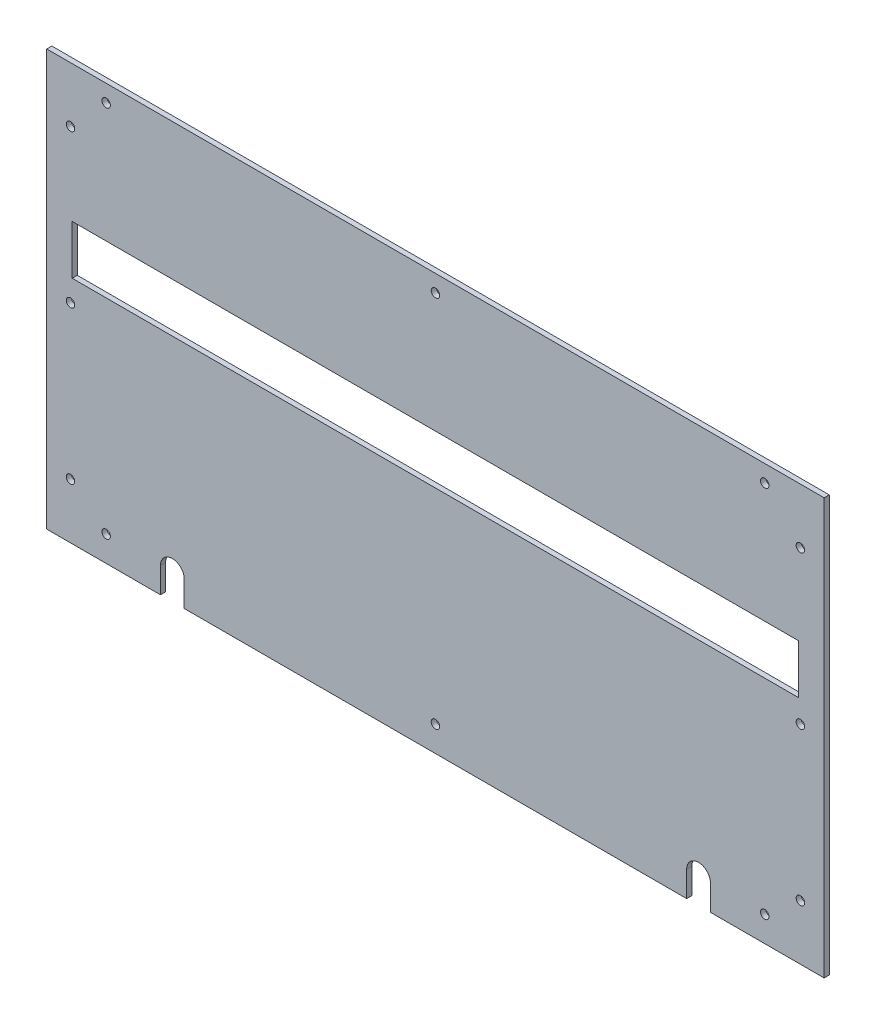
ISO-10303-21;
HEADER;
FILE_DESCRIPTION(('STEP AP214'),'2;1');
FILE_NAME('part.step','',(''),(''),'','','');
FILE_SCHEMA(('AUTOMOTIVE_DESIGN { 1 0 10303 214 1 1 1 1 }'));
ENDSEC;
DATA;
#1=APPLICATION_CONTEXT('core data for automotive mechanical design processes');
#2=APPLICATION_PROTOCOL_DEFINITION('international standard','automotive_design',2000,#1);
#3=PRODUCT_CONTEXT('',#1,'mechanical');
#4=PRODUCT('Part','Part','',(#3));
#5=PRODUCT_RELATED_PRODUCT_CATEGORY('part','',(#4));
#6=PRODUCT_DEFINITION_FORMATION('','',#4);
#7=PRODUCT_DEFINITION_CONTEXT('part definition',#1,'design');
#8=PRODUCT_DEFINITION('design','',#6,#7);
#9=PRODUCT_DEFINITION_SHAPE('','',#8);
#10=(LENGTH_UNIT() NAMED_UNIT(*) SI_UNIT(.MILLI.,.METRE.));
#11=(NAMED_UNIT(*) PLANE_ANGLE_UNIT() SI_UNIT($,.RADIAN.));
#12=(NAMED_UNIT(*) SI_UNIT($,.STERADIAN.) SOLID_ANGLE_UNIT());
#13=UNCERTAINTY_MEASURE_WITH_UNIT(LENGTH_MEASURE(1.E-05),#10,'distance_accuracy_value','');
#14=(GEOMETRIC_REPRESENTATION_CONTEXT(3) GLOBAL_UNCERTAINTY_ASSIGNED_CONTEXT((#13)) GLOBAL_UNIT_ASSIGNED_CONTEXT((#10,
#11,#12)) REPRESENTATION_CONTEXT('',''));
#15=CARTESIAN_POINT('',(0.,0.,0.));
#16=DIRECTION('',(0.,0.,1.));
#17=DIRECTION('',(1.,0.,0.));
#18=AXIS2_PLACEMENT_3D('',#15,#16,#17);
#19=CARTESIAN_POINT('',(-229.,-122.5,3.));
#20=DIRECTION('',(0.,1.,0.));
#21=DIRECTION('',(0.,0.,1.));
#22=AXIS2_PLACEMENT_3D('',#19,#20,#21);
#23=PLANE('',#22);
#24=DIRECTION('',(1.,0.,0.));
#25=VECTOR('',#24,1.);
#26=CARTESIAN_POINT('',(-229.,-122.5,3.));
#27=LINE('',#26,#25);
#28=CARTESIAN_POINT('',(-148.,-122.5,3.));
#29=VERTEX_POINT('',#28);
#30=CARTESIAN_POINT('',(148.,-122.5,3.));
#31=VERTEX_POINT('',#30);
#32=EDGE_CURVE('E328',#29,#31,#27,.T.);
#33=ORIENTED_EDGE('',*,*,#32,.F.);
#34=DIRECTION('',(0.,0.,1.));
#35=VECTOR('',#34,1.);
#36=CARTESIAN_POINT('',(-148.,-122.5,0.));
#37=LINE('',#36,#35);
#38=CARTESIAN_POINT('',(-148.,-122.5,0.));
#39=VERTEX_POINT('',#38);
#40=EDGE_CURVE('E285',#39,#29,#37,.T.);
#41=ORIENTED_EDGE('',*,*,#40,.F.);
#42=DIRECTION('',(1.,0.,0.));
#43=VECTOR('',#42,1.);
#44=CARTESIAN_POINT('',(-229.,-122.5,0.));
#45=LINE('',#44,#43);
#46=CARTESIAN_POINT('',(148.,-122.5,0.));
#47=VERTEX_POINT('',#46);
#48=EDGE_CURVE('E338',#39,#47,#45,.T.);
#49=ORIENTED_EDGE('',*,*,#48,.T.);
#50=DIRECTION('',(0.,0.,1.));
#51=VECTOR('',#50,1.);
#52=CARTESIAN_POINT('',(148.,-122.5,0.));
#53=LINE('',#52,#51);
#54=EDGE_CURVE('E294',#47,#31,#53,.T.);
#55=ORIENTED_EDGE('',*,*,#54,.T.);
#56=EDGE_LOOP('',(#33,#41,#49,#55));
#57=FACE_BOUND('',#56,.T.);
#58=ADVANCED_FACE('F41',(#57),#23,.F.);
#59=CARTESIAN_POINT('',(162.,-122.5,3.));
#60=VERTEX_POINT('',#59);
#61=CARTESIAN_POINT('',(229.,-122.5,3.));
#62=VERTEX_POINT('',#61);
#63=EDGE_CURVE('E323',#60,#62,#27,.T.);
#64=ORIENTED_EDGE('',*,*,#63,.F.);
#65=DIRECTION('',(0.,0.,1.));
#66=VECTOR('',#65,1.);
#67=CARTESIAN_POINT('',(162.,-122.5,0.));
#68=LINE('',#67,#66);
#69=CARTESIAN_POINT('',(162.,-122.5,0.));
#70=VERTEX_POINT('',#69);
#71=EDGE_CURVE('E297',#70,#60,#68,.T.);
#72=ORIENTED_EDGE('',*,*,#71,.F.);
#73=CARTESIAN_POINT('',(229.,-122.5,0.));
#74=VERTEX_POINT('',#73);
#75=EDGE_CURVE('E335',#70,#74,#45,.T.);
#76=ORIENTED_EDGE('',*,*,#75,.T.);
#77=DIRECTION('',(0.,0.,-1.));
#78=VECTOR('',#77,1.);
#79=CARTESIAN_POINT('',(229.,-122.5,3.));
#80=LINE('',#79,#78);
#81=EDGE_CURVE('E327',#62,#74,#80,.T.);
#82=ORIENTED_EDGE('',*,*,#81,.F.);
#83=EDGE_LOOP('',(#64,#72,#76,#82));
#84=FACE_BOUND('',#83,.T.);
#85=ADVANCED_FACE('F385',(#84),#23,.F.);
#86=CARTESIAN_POINT('',(229.,122.5,3.));
#87=DIRECTION('',(-1.,0.,0.));
#88=DIRECTION('',(0.,-1.,0.));
#89=AXIS2_PLACEMENT_3D('',#86,#87,#88);
#90=PLANE('',#89);
#91=DIRECTION('',(0.,1.,0.));
#92=VECTOR('',#91,1.);
#93=CARTESIAN_POINT('',(229.,122.5,0.));
#94=LINE('',#93,#92);
#95=CARTESIAN_POINT('',(229.,122.5,0.));
#96=VERTEX_POINT('',#95);
#97=EDGE_CURVE('E284',#74,#96,#94,.T.);
#98=ORIENTED_EDGE('',*,*,#97,.T.);
#99=DIRECTION('',(0.,0.,-1.));
#100=VECTOR('',#99,1.);
#101=CARTESIAN_POINT('',(229.,122.5,3.));
#102=LINE('',#101,#100);
#103=CARTESIAN_POINT('',(229.,122.5,3.));
#104=VERTEX_POINT('',#103);
#105=EDGE_CURVE('E11',#104,#96,#102,.T.);
#106=ORIENTED_EDGE('',*,*,#105,.F.);
#107=DIRECTION('',(0.,1.,0.));
#108=VECTOR('',#107,1.);
#109=CARTESIAN_POINT('',(229.,122.5,3.));
#110=LINE('',#109,#108);
#111=EDGE_CURVE('E315',#62,#104,#110,.T.);
#112=ORIENTED_EDGE('',*,*,#111,.F.);
#113=ORIENTED_EDGE('',*,*,#81,.T.);
#114=EDGE_LOOP('',(#98,#106,#112,#113));
#115=FACE_BOUND('',#114,.T.);
#116=ADVANCED_FACE('F43',(#115),#90,.F.);
#117=CARTESIAN_POINT('',(-229.,122.5,3.));
#118=DIRECTION('',(0.,-1.,0.));
#119=DIRECTION('',(0.,0.,-1.));
#120=AXIS2_PLACEMENT_3D('',#117,#118,#119);
#121=PLANE('',#120);
#122=DIRECTION('',(-1.,0.,0.));
#123=VECTOR('',#122,1.);
#124=CARTESIAN_POINT('',(-229.,122.5,0.));
#125=LINE('',#124,#123);
#126=CARTESIAN_POINT('',(-229.,122.5,0.));
#127=VERTEX_POINT('',#126);
#128=EDGE_CURVE('E331',#96,#127,#125,.T.);
#129=ORIENTED_EDGE('',*,*,#128,.T.);
#130=DIRECTION('',(0.,0.,-1.));
#131=VECTOR('',#130,1.);
#132=CARTESIAN_POINT('',(-229.,122.5,3.));
#133=LINE('',#132,#131);
#134=CARTESIAN_POINT('',(-229.,122.5,3.));
#135=VERTEX_POINT('',#134);
#136=EDGE_CURVE('E49',#135,#127,#133,.T.);
#137=ORIENTED_EDGE('',*,*,#136,.F.);
#138=DIRECTION('',(-1.,0.,0.));
#139=VECTOR('',#138,1.);
#140=CARTESIAN_POINT('',(-229.,122.5,3.));
#141=LINE('',#140,#139);
#142=EDGE_CURVE('E318',#104,#135,#141,.T.);
#143=ORIENTED_EDGE('',*,*,#142,.F.);
#144=ORIENTED_EDGE('',*,*,#105,.T.);
#145=EDGE_LOOP('',(#129,#137,#143,#144));
#146=FACE_BOUND('',#145,.T.);
#147=ADVANCED_FACE('F366',(#146),#121,.F.);
#148=CARTESIAN_POINT('',(-229.,122.5,3.));
#149=DIRECTION('',(1.,0.,0.));
#150=DIRECTION('',(0.,0.,-1.));
#151=AXIS2_PLACEMENT_3D('',#148,#149,#150);
#152=PLANE('',#151);
#153=DIRECTION('',(0.,-1.,0.));
#154=VECTOR('',#153,1.);
#155=CARTESIAN_POINT('',(-229.,122.5,0.));
#156=LINE('',#155,#154);
#157=CARTESIAN_POINT('',(-229.,-122.5,0.));
#158=VERTEX_POINT('',#157);
#159=EDGE_CURVE('E333',#127,#158,#156,.T.);
#160=ORIENTED_EDGE('',*,*,#159,.T.);
#161=DIRECTION('',(0.,0.,-1.));
#162=VECTOR('',#161,1.);
#163=CARTESIAN_POINT('',(-229.,-122.5,3.));
#164=LINE('',#163,#162);
#165=CARTESIAN_POINT('',(-229.,-122.5,3.));
#166=VERTEX_POINT('',#165);
#167=EDGE_CURVE('E341',#166,#158,#164,.T.);
#168=ORIENTED_EDGE('',*,*,#167,.F.);
#169=DIRECTION('',(0.,-1.,0.));
#170=VECTOR('',#169,1.);
#171=CARTESIAN_POINT('',(-229.,122.5,3.));
#172=LINE('',#171,#170);
#173=EDGE_CURVE('E321',#135,#166,#172,.T.);
#174=ORIENTED_EDGE('',*,*,#173,.F.);
#175=ORIENTED_EDGE('',*,*,#136,.T.);
#176=EDGE_LOOP('',(#160,#168,#174,#175));
#177=FACE_BOUND('',#176,.T.);
#178=ADVANCED_FACE('F348',(#177),#152,.F.);
#179=CARTESIAN_POINT('',(-162.,-122.5,0.));
#180=VERTEX_POINT('',#179);
#181=EDGE_CURVE('E319',#158,#180,#45,.T.);
#182=ORIENTED_EDGE('',*,*,#181,.T.);
#183=DIRECTION('',(0.,0.,1.));
#184=VECTOR('',#183,1.);
#185=CARTESIAN_POINT('',(-162.,-122.5,0.));
#186=LINE('',#185,#184);
#187=CARTESIAN_POINT('',(-162.,-122.5,3.));
#188=VERTEX_POINT('',#187);
#189=EDGE_CURVE('E287',#180,#188,#186,.T.);
#190=ORIENTED_EDGE('',*,*,#189,.T.);
#191=EDGE_CURVE('E324',#166,#188,#27,.T.);
#192=ORIENTED_EDGE('',*,*,#191,.F.);
#193=ORIENTED_EDGE('',*,*,#167,.T.);
#194=EDGE_LOOP('',(#182,#190,#192,#193));
#195=FACE_BOUND('',#194,.T.);
#196=ADVANCED_FACE('F357',(#195),#23,.F.);
#197=CARTESIAN_POINT('',(0.,0.,3.));
#198=DIRECTION('',(0.,0.,1.));
#199=DIRECTION('',(1.,0.,0.));
#200=AXIS2_PLACEMENT_3D('',#197,#198,#199);
#201=PLANE('',#200);
#202=DIRECTION('',(0.,-1.,0.));
#203=VECTOR('',#202,1.);
#204=CARTESIAN_POINT('',(-214.,42.,3.));
#205=LINE('',#204,#203);
#206=CARTESIAN_POINT('',(-214.,42.,3.));
#207=VERTEX_POINT('',#206);
#208=CARTESIAN_POINT('',(-214.,13.,3.));
#209=VERTEX_POINT('',#208);
#210=EDGE_CURVE('E56',#207,#209,#205,.T.);
#211=ORIENTED_EDGE('',*,*,#210,.F.);
#212=DIRECTION('',(-1.,0.,0.));
#213=VECTOR('',#212,1.);
#214=CARTESIAN_POINT('',(214.,42.,3.));
#215=LINE('',#214,#213);
#216=CARTESIAN_POINT('',(214.,42.,3.));
#217=VERTEX_POINT('',#216);
#218=EDGE_CURVE('E172',#217,#207,#215,.T.);
#219=ORIENTED_EDGE('',*,*,#218,.F.);
#220=DIRECTION('',(0.,1.,0.));
#221=VECTOR('',#220,1.);
#222=CARTESIAN_POINT('',(214.,13.,3.));
#223=LINE('',#222,#221);
#224=CARTESIAN_POINT('',(214.,13.,3.));
#225=VERTEX_POINT('',#224);
#226=EDGE_CURVE('E175',#225,#217,#223,.T.);
#227=ORIENTED_EDGE('',*,*,#226,.F.);
#228=DIRECTION('',(1.,0.,0.));
#229=VECTOR('',#228,1.);
#230=CARTESIAN_POINT('',(-214.,13.,3.));
#231=LINE('',#230,#229);
#232=EDGE_CURVE('E181',#209,#225,#231,.T.);
#233=ORIENTED_EDGE('',*,*,#232,.F.);
#234=EDGE_LOOP('',(#211,#219,#227,#233));
#235=FACE_BOUND('',#234,.T.);
#236=CARTESIAN_POINT('',(215.,-90.,3.));
#237=DIRECTION('',(0.,0.,1.));
#238=DIRECTION('',(1.,0.,0.));
#239=AXIS2_PLACEMENT_3D('',#236,#237,#238);
#240=CIRCLE('',#239,2.50000000000002);
#241=CARTESIAN_POINT('',(217.5,-90.,3.));
#242=VERTEX_POINT('',#241);
#243=EDGE_CURVE('E228',#242,#242,#240,.T.);
#244=ORIENTED_EDGE('',*,*,#243,.F.);
#245=EDGE_LOOP('',(#244));
#246=FACE_BOUND('',#245,.T.);
#247=CARTESIAN_POINT('',(215.,0.,3.));
#248=DIRECTION('',(0.,0.,1.));
#249=DIRECTION('',(1.,0.,0.));
#250=AXIS2_PLACEMENT_3D('',#247,#248,#249);
#251=CIRCLE('',#250,2.50000000000002);
#252=CARTESIAN_POINT('',(217.5,0.,3.));
#253=VERTEX_POINT('',#252);
#254=EDGE_CURVE('E222',#253,#253,#251,.T.);
#255=ORIENTED_EDGE('',*,*,#254,.F.);
#256=EDGE_LOOP('',(#255));
#257=FACE_BOUND('',#256,.T.);
#258=CARTESIAN_POINT('',(-215.,89.9999999999999,3.));
#259=DIRECTION('',(0.,0.,1.));
#260=DIRECTION('',(1.,0.,0.));
#261=AXIS2_PLACEMENT_3D('',#258,#259,#260);
#262=CIRCLE('',#261,2.5);
#263=CARTESIAN_POINT('',(-212.5,89.9999999999999,3.));
#264=VERTEX_POINT('',#263);
#265=EDGE_CURVE('E216',#264,#264,#262,.T.);
#266=ORIENTED_EDGE('',*,*,#265,.F.);
#267=EDGE_LOOP('',(#266));
#268=FACE_BOUND('',#267,.T.);
#269=CARTESIAN_POINT('',(-215.,-90.0000000000001,3.));
#270=DIRECTION('',(0.,0.,1.));
#271=DIRECTION('',(1.,0.,0.));
#272=AXIS2_PLACEMENT_3D('',#269,#270,#271);
#273=CIRCLE('',#272,2.5);
#274=CARTESIAN_POINT('',(-212.5,-90.0000000000001,3.));
#275=VERTEX_POINT('',#274);
#276=EDGE_CURVE('E209',#275,#275,#273,.T.);
#277=ORIENTED_EDGE('',*,*,#276,.F.);
#278=EDGE_LOOP('',(#277));
#279=FACE_BOUND('',#278,.T.);
#280=CARTESIAN_POINT('',(-215.,0.,3.));
#281=DIRECTION('',(0.,0.,1.));
#282=DIRECTION('',(1.,0.,0.));
#283=AXIS2_PLACEMENT_3D('',#280,#281,#282);
#284=CIRCLE('',#283,2.5);
#285=CARTESIAN_POINT('',(-212.5,0.,3.));
#286=VERTEX_POINT('',#285);
#287=EDGE_CURVE('E252',#286,#286,#284,.T.);
#288=ORIENTED_EDGE('',*,*,#287,.F.);
#289=EDGE_LOOP('',(#288));
#290=FACE_BOUND('',#289,.T.);
#291=CARTESIAN_POINT('',(194.,112.5,3.));
#292=DIRECTION('',(0.,0.,1.));
#293=DIRECTION('',(1.,0.,0.));
#294=AXIS2_PLACEMENT_3D('',#291,#292,#293);
#295=CIRCLE('',#294,2.50000000000023);
#296=CARTESIAN_POINT('',(196.5,112.5,3.));
#297=VERTEX_POINT('',#296);
#298=EDGE_CURVE('E246',#297,#297,#295,.T.);
#299=ORIENTED_EDGE('',*,*,#298,.F.);
#300=EDGE_LOOP('',(#299));
#301=FACE_BOUND('',#300,.T.);
#302=CARTESIAN_POINT('',(194.,-107.5,3.));
#303=DIRECTION('',(0.,0.,1.));
#304=DIRECTION('',(1.,0.,0.));
#305=AXIS2_PLACEMENT_3D('',#302,#303,#304);
#306=CIRCLE('',#305,2.50000000000008);
#307=CARTESIAN_POINT('',(196.5,-107.5,3.));
#308=VERTEX_POINT('',#307);
#309=EDGE_CURVE('E240',#308,#308,#306,.T.);
#310=ORIENTED_EDGE('',*,*,#309,.F.);
#311=EDGE_LOOP('',(#310));
#312=FACE_BOUND('',#311,.T.);
#313=CARTESIAN_POINT('',(-194.,-107.5,3.));
#314=DIRECTION('',(0.,0.,1.));
#315=DIRECTION('',(1.,0.,0.));
#316=AXIS2_PLACEMENT_3D('',#313,#314,#315);
#317=CIRCLE('',#316,2.50000000000002);
#318=CARTESIAN_POINT('',(-191.5,-107.5,3.));
#319=VERTEX_POINT('',#318);
#320=EDGE_CURVE('E233',#319,#319,#317,.T.);
#321=ORIENTED_EDGE('',*,*,#320,.F.);
#322=EDGE_LOOP('',(#321));
#323=FACE_BOUND('',#322,.T.);
#324=CARTESIAN_POINT('',(215.,90.,3.));
#325=DIRECTION('',(0.,0.,1.));
#326=DIRECTION('',(1.,0.,0.));
#327=AXIS2_PLACEMENT_3D('',#324,#325,#326);
#328=CIRCLE('',#327,2.50000000000002);
#329=CARTESIAN_POINT('',(217.5,90.,3.));
#330=VERTEX_POINT('',#329);
#331=EDGE_CURVE('E191',#330,#330,#328,.T.);
#332=ORIENTED_EDGE('',*,*,#331,.F.);
#333=EDGE_LOOP('',(#332));
#334=FACE_BOUND('',#333,.T.);
#335=CARTESIAN_POINT('',(0.,112.5,3.));
#336=DIRECTION('',(0.,0.,1.));
#337=DIRECTION('',(1.,0.,0.));
#338=AXIS2_PLACEMENT_3D('',#335,#336,#337);
#339=CIRCLE('',#338,2.5);
#340=CARTESIAN_POINT('',(2.5,112.5,3.));
#341=VERTEX_POINT('',#340);
#342=EDGE_CURVE('E198',#341,#341,#339,.T.);
#343=ORIENTED_EDGE('',*,*,#342,.F.);
#344=EDGE_LOOP('',(#343));
#345=FACE_BOUND('',#344,.T.);
#346=CARTESIAN_POINT('',(0.,-107.5,3.));
#347=DIRECTION('',(0.,0.,1.));
#348=DIRECTION('',(1.,0.,0.));
#349=AXIS2_PLACEMENT_3D('',#346,#347,#348);
#350=CIRCLE('',#349,2.5);
#351=CARTESIAN_POINT('',(2.5,-107.5,3.));
#352=VERTEX_POINT('',#351);
#353=EDGE_CURVE('E204',#352,#352,#350,.T.);
#354=ORIENTED_EDGE('',*,*,#353,.F.);
#355=EDGE_LOOP('',(#354));
#356=FACE_BOUND('',#355,.T.);
#357=CARTESIAN_POINT('',(-194.,112.5,3.));
#358=DIRECTION('',(0.,0.,1.));
#359=DIRECTION('',(1.,0.,0.));
#360=AXIS2_PLACEMENT_3D('',#357,#358,#359);
#361=CIRCLE('',#360,2.5);
#362=CARTESIAN_POINT('',(-191.5,112.5,3.));
#363=VERTEX_POINT('',#362);
#364=EDGE_CURVE('E236',#363,#363,#361,.T.);
#365=ORIENTED_EDGE('',*,*,#364,.F.);
#366=EDGE_LOOP('',(#365));
#367=FACE_BOUND('',#366,.T.);
#368=DIRECTION('',(0.,1.,0.));
#369=VECTOR('',#368,1.);
#370=CARTESIAN_POINT('',(-148.,-107.5,3.));
#371=LINE('',#370,#369);
#372=CARTESIAN_POINT('',(-148.,-107.5,3.));
#373=VERTEX_POINT('',#372);
#374=EDGE_CURVE('E267',#29,#373,#371,.T.);
#375=ORIENTED_EDGE('',*,*,#374,.F.);
#376=ORIENTED_EDGE('',*,*,#32,.T.);
#377=DIRECTION('',(0.,-1.,0.));
#378=VECTOR('',#377,1.);
#379=CARTESIAN_POINT('',(148.,-107.5,3.));
#380=LINE('',#379,#378);
#381=CARTESIAN_POINT('',(148.,-107.5,3.));
#382=VERTEX_POINT('',#381);
#383=EDGE_CURVE('E303',#382,#31,#380,.T.);
#384=ORIENTED_EDGE('',*,*,#383,.F.);
#385=CARTESIAN_POINT('',(155.,-107.5,3.));
#386=DIRECTION('',(0.,0.,1.));
#387=DIRECTION('',(1.,0.,0.));
#388=AXIS2_PLACEMENT_3D('',#385,#386,#387);
#389=CIRCLE('',#388,7.00000000000001);
#390=CARTESIAN_POINT('',(162.,-107.5,3.));
#391=VERTEX_POINT('',#390);
#392=EDGE_CURVE('E278',#391,#382,#389,.T.);
#393=ORIENTED_EDGE('',*,*,#392,.F.);
#394=DIRECTION('',(0.,1.,0.));
#395=VECTOR('',#394,1.);
#396=CARTESIAN_POINT('',(162.,-107.5,3.));
#397=LINE('',#396,#395);
#398=EDGE_CURVE('E300',#60,#391,#397,.T.);
#399=ORIENTED_EDGE('',*,*,#398,.F.);
#400=ORIENTED_EDGE('',*,*,#63,.T.);
#401=ORIENTED_EDGE('',*,*,#111,.T.);
#402=ORIENTED_EDGE('',*,*,#142,.T.);
#403=ORIENTED_EDGE('',*,*,#173,.T.);
#404=ORIENTED_EDGE('',*,*,#191,.T.);
#405=DIRECTION('',(0.,-1.,0.));
#406=VECTOR('',#405,1.);
#407=CARTESIAN_POINT('',(-162.,-107.5,3.));
#408=LINE('',#407,#406);
#409=CARTESIAN_POINT('',(-162.,-107.5,3.));
#410=VERTEX_POINT('',#409);
#411=EDGE_CURVE('E277',#410,#188,#408,.T.);
#412=ORIENTED_EDGE('',*,*,#411,.F.);
#413=CARTESIAN_POINT('',(-155.,-107.5,3.));
#414=DIRECTION('',(0.,0.,1.));
#415=DIRECTION('',(1.,0.,0.));
#416=AXIS2_PLACEMENT_3D('',#413,#414,#415);
#417=CIRCLE('',#416,6.99999999999998);
#418=EDGE_CURVE('E274',#373,#410,#417,.T.);
#419=ORIENTED_EDGE('',*,*,#418,.F.);
#420=EDGE_LOOP('',(#375,#376,#384,#393,#399,#400,#401,#402,#403,#404,#412,#419));
#421=FACE_BOUND('',#420,.T.);
#422=ADVANCED_FACE('F362',(#235,#246,#257,#268,#279,#290,#301,#312,#323,#334,#345,#356,#367,
#421),#201,.T.);
#423=CARTESIAN_POINT('',(0.,0.,0.));
#424=DIRECTION('',(0.,0.,1.));
#425=DIRECTION('',(1.,0.,0.));
#426=AXIS2_PLACEMENT_3D('',#423,#424,#425);
#427=PLANE('',#426);
#428=DIRECTION('',(-1.,0.,0.));
#429=VECTOR('',#428,1.);
#430=CARTESIAN_POINT('',(214.,42.,0.));
#431=LINE('',#430,#429);
#432=CARTESIAN_POINT('',(214.,42.,0.));
#433=VERTEX_POINT('',#432);
#434=CARTESIAN_POINT('',(-214.,42.,0.));
#435=VERTEX_POINT('',#434);
#436=EDGE_CURVE('E162',#433,#435,#431,.T.);
#437=ORIENTED_EDGE('',*,*,#436,.T.);
#438=DIRECTION('',(0.,-1.,0.));
#439=VECTOR('',#438,1.);
#440=CARTESIAN_POINT('',(-214.,42.,0.));
#441=LINE('',#440,#439);
#442=CARTESIAN_POINT('',(-214.,13.,0.));
#443=VERTEX_POINT('',#442);
#444=EDGE_CURVE('E156',#435,#443,#441,.T.);
#445=ORIENTED_EDGE('',*,*,#444,.T.);
#446=DIRECTION('',(1.,0.,0.));
#447=VECTOR('',#446,1.);
#448=CARTESIAN_POINT('',(-214.,13.,0.));
#449=LINE('',#448,#447);
#450=CARTESIAN_POINT('',(214.,13.,0.));
#451=VERTEX_POINT('',#450);
#452=EDGE_CURVE('E165',#443,#451,#449,.T.);
#453=ORIENTED_EDGE('',*,*,#452,.T.);
#454=DIRECTION('',(0.,1.,0.));
#455=VECTOR('',#454,1.);
#456=CARTESIAN_POINT('',(214.,13.,0.));
#457=LINE('',#456,#455);
#458=EDGE_CURVE('E64',#451,#433,#457,.T.);
#459=ORIENTED_EDGE('',*,*,#458,.T.);
#460=EDGE_LOOP('',(#437,#445,#453,#459));
#461=FACE_BOUND('',#460,.T.);
#462=CARTESIAN_POINT('',(215.,-90.,0.));
#463=DIRECTION('',(0.,0.,1.));
#464=DIRECTION('',(1.,0.,0.));
#465=AXIS2_PLACEMENT_3D('',#462,#463,#464);
#466=CIRCLE('',#465,2.50000000000002);
#467=CARTESIAN_POINT('',(217.5,-90.,0.));
#468=VERTEX_POINT('',#467);
#469=EDGE_CURVE('E194',#468,#468,#466,.T.);
#470=ORIENTED_EDGE('',*,*,#469,.T.);
#471=EDGE_LOOP('',(#470));
#472=FACE_BOUND('',#471,.T.);
#473=CARTESIAN_POINT('',(215.,0.,0.));
#474=DIRECTION('',(0.,0.,1.));
#475=DIRECTION('',(1.,0.,0.));
#476=AXIS2_PLACEMENT_3D('',#473,#474,#475);
#477=CIRCLE('',#476,2.50000000000002);
#478=CARTESIAN_POINT('',(217.5,0.,0.));
#479=VERTEX_POINT('',#478);
#480=EDGE_CURVE('E225',#479,#479,#477,.T.);
#481=ORIENTED_EDGE('',*,*,#480,.T.);
#482=EDGE_LOOP('',(#481));
#483=FACE_BOUND('',#482,.T.);
#484=CARTESIAN_POINT('',(-215.,89.9999999999999,0.));
#485=DIRECTION('',(0.,0.,1.));
#486=DIRECTION('',(1.,0.,0.));
#487=AXIS2_PLACEMENT_3D('',#484,#485,#486);
#488=CIRCLE('',#487,2.5);
#489=CARTESIAN_POINT('',(-212.5,89.9999999999999,0.));
#490=VERTEX_POINT('',#489);
#491=EDGE_CURVE('E219',#490,#490,#488,.T.);
#492=ORIENTED_EDGE('',*,*,#491,.T.);
#493=EDGE_LOOP('',(#492));
#494=FACE_BOUND('',#493,.T.);
#495=CARTESIAN_POINT('',(-215.,-90.0000000000001,0.));
#496=DIRECTION('',(0.,0.,1.));
#497=DIRECTION('',(1.,0.,0.));
#498=AXIS2_PLACEMENT_3D('',#495,#496,#497);
#499=CIRCLE('',#498,2.5);
#500=CARTESIAN_POINT('',(-212.5,-90.0000000000001,0.));
#501=VERTEX_POINT('',#500);
#502=EDGE_CURVE('E213',#501,#501,#499,.T.);
#503=ORIENTED_EDGE('',*,*,#502,.T.);
#504=EDGE_LOOP('',(#503));
#505=FACE_BOUND('',#504,.T.);
#506=CARTESIAN_POINT('',(-215.,0.,0.));
#507=DIRECTION('',(0.,0.,1.));
#508=DIRECTION('',(1.,0.,0.));
#509=AXIS2_PLACEMENT_3D('',#506,#507,#508);
#510=CIRCLE('',#509,2.5);
#511=CARTESIAN_POINT('',(-212.5,0.,0.));
#512=VERTEX_POINT('',#511);
#513=EDGE_CURVE('E212',#512,#512,#510,.T.);
#514=ORIENTED_EDGE('',*,*,#513,.T.);
#515=EDGE_LOOP('',(#514));
#516=FACE_BOUND('',#515,.T.);
#517=CARTESIAN_POINT('',(194.,112.5,0.));
#518=DIRECTION('',(0.,0.,1.));
#519=DIRECTION('',(1.,0.,0.));
#520=AXIS2_PLACEMENT_3D('',#517,#518,#519);
#521=CIRCLE('',#520,2.50000000000023);
#522=CARTESIAN_POINT('',(196.5,112.5,0.));
#523=VERTEX_POINT('',#522);
#524=EDGE_CURVE('E249',#523,#523,#521,.T.);
#525=ORIENTED_EDGE('',*,*,#524,.T.);
#526=EDGE_LOOP('',(#525));
#527=FACE_BOUND('',#526,.T.);
#528=CARTESIAN_POINT('',(194.,-107.5,0.));
#529=DIRECTION('',(0.,0.,1.));
#530=DIRECTION('',(1.,0.,0.));
#531=AXIS2_PLACEMENT_3D('',#528,#529,#530);
#532=CIRCLE('',#531,2.50000000000008);
#533=CARTESIAN_POINT('',(196.5,-107.5,0.));
#534=VERTEX_POINT('',#533);
#535=EDGE_CURVE('E243',#534,#534,#532,.T.);
#536=ORIENTED_EDGE('',*,*,#535,.T.);
#537=EDGE_LOOP('',(#536));
#538=FACE_BOUND('',#537,.T.);
#539=CARTESIAN_POINT('',(-194.,-107.5,0.));
#540=DIRECTION('',(0.,0.,1.));
#541=DIRECTION('',(1.,0.,0.));
#542=AXIS2_PLACEMENT_3D('',#539,#540,#541);
#543=CIRCLE('',#542,2.50000000000002);
#544=CARTESIAN_POINT('',(-191.5,-107.5,0.));
#545=VERTEX_POINT('',#544);
#546=EDGE_CURVE('E237',#545,#545,#543,.T.);
#547=ORIENTED_EDGE('',*,*,#546,.T.);
#548=EDGE_LOOP('',(#547));
#549=FACE_BOUND('',#548,.T.);
#550=CARTESIAN_POINT('',(215.,90.,0.));
#551=DIRECTION('',(0.,0.,1.));
#552=DIRECTION('',(1.,0.,0.));
#553=AXIS2_PLACEMENT_3D('',#550,#551,#552);
#554=CIRCLE('',#553,2.50000000000002);
#555=CARTESIAN_POINT('',(217.5,90.,0.));
#556=VERTEX_POINT('',#555);
#557=EDGE_CURVE('E195',#556,#556,#554,.T.);
#558=ORIENTED_EDGE('',*,*,#557,.T.);
#559=EDGE_LOOP('',(#558));
#560=FACE_BOUND('',#559,.T.);
#561=CARTESIAN_POINT('',(0.,112.5,0.));
#562=DIRECTION('',(0.,0.,1.));
#563=DIRECTION('',(1.,0.,0.));
#564=AXIS2_PLACEMENT_3D('',#561,#562,#563);
#565=CIRCLE('',#564,2.5);
#566=CARTESIAN_POINT('',(2.5,112.5,0.));
#567=VERTEX_POINT('',#566);
#568=EDGE_CURVE('E201',#567,#567,#565,.T.);
#569=ORIENTED_EDGE('',*,*,#568,.T.);
#570=EDGE_LOOP('',(#569));
#571=FACE_BOUND('',#570,.T.);
#572=CARTESIAN_POINT('',(0.,-107.5,0.));
#573=DIRECTION('',(0.,0.,1.));
#574=DIRECTION('',(1.,0.,0.));
#575=AXIS2_PLACEMENT_3D('',#572,#573,#574);
#576=CIRCLE('',#575,2.5);
#577=CARTESIAN_POINT('',(2.5,-107.5,0.));
#578=VERTEX_POINT('',#577);
#579=EDGE_CURVE('E187',#578,#578,#576,.T.);
#580=ORIENTED_EDGE('',*,*,#579,.T.);
#581=EDGE_LOOP('',(#580));
#582=FACE_BOUND('',#581,.T.);
#583=CARTESIAN_POINT('',(-194.,112.5,0.));
#584=DIRECTION('',(0.,0.,1.));
#585=DIRECTION('',(1.,0.,0.));
#586=AXIS2_PLACEMENT_3D('',#583,#584,#585);
#587=CIRCLE('',#586,2.5);
#588=CARTESIAN_POINT('',(-191.5,112.5,0.));
#589=VERTEX_POINT('',#588);
#590=EDGE_CURVE('E257',#589,#589,#587,.T.);
#591=ORIENTED_EDGE('',*,*,#590,.T.);
#592=EDGE_LOOP('',(#591));
#593=FACE_BOUND('',#592,.T.);
#594=ORIENTED_EDGE('',*,*,#48,.F.);
#595=DIRECTION('',(0.,1.,0.));
#596=VECTOR('',#595,1.);
#597=CARTESIAN_POINT('',(-148.,-107.5,0.));
#598=LINE('',#597,#596);
#599=CARTESIAN_POINT('',(-148.,-107.5,0.));
#600=VERTEX_POINT('',#599);
#601=EDGE_CURVE('E270',#39,#600,#598,.T.);
#602=ORIENTED_EDGE('',*,*,#601,.T.);
#603=CARTESIAN_POINT('',(-155.,-107.5,0.));
#604=DIRECTION('',(0.,0.,1.));
#605=DIRECTION('',(1.,0.,0.));
#606=AXIS2_PLACEMENT_3D('',#603,#604,#605);
#607=CIRCLE('',#606,6.99999999999998);
#608=CARTESIAN_POINT('',(-162.,-107.5,0.));
#609=VERTEX_POINT('',#608);
#610=EDGE_CURVE('E263',#600,#609,#607,.T.);
#611=ORIENTED_EDGE('',*,*,#610,.T.);
#612=DIRECTION('',(0.,-1.,0.));
#613=VECTOR('',#612,1.);
#614=CARTESIAN_POINT('',(-162.,-107.5,0.));
#615=LINE('',#614,#613);
#616=EDGE_CURVE('E266',#609,#180,#615,.T.);
#617=ORIENTED_EDGE('',*,*,#616,.T.);
#618=ORIENTED_EDGE('',*,*,#181,.F.);
#619=ORIENTED_EDGE('',*,*,#159,.F.);
#620=ORIENTED_EDGE('',*,*,#128,.F.);
#621=ORIENTED_EDGE('',*,*,#97,.F.);
#622=ORIENTED_EDGE('',*,*,#75,.F.);
#623=DIRECTION('',(0.,1.,0.));
#624=VECTOR('',#623,1.);
#625=CARTESIAN_POINT('',(162.,-107.5,0.));
#626=LINE('',#625,#624);
#627=CARTESIAN_POINT('',(162.,-107.5,0.));
#628=VERTEX_POINT('',#627);
#629=EDGE_CURVE('E293',#70,#628,#626,.T.);
#630=ORIENTED_EDGE('',*,*,#629,.T.);
#631=CARTESIAN_POINT('',(155.,-107.5,0.));
#632=DIRECTION('',(0.,0.,1.));
#633=DIRECTION('',(1.,0.,0.));
#634=AXIS2_PLACEMENT_3D('',#631,#632,#633);
#635=CIRCLE('',#634,7.00000000000001);
#636=CARTESIAN_POINT('',(148.,-107.5,0.));
#637=VERTEX_POINT('',#636);
#638=EDGE_CURVE('E304',#628,#637,#635,.T.);
#639=ORIENTED_EDGE('',*,*,#638,.T.);
#640=DIRECTION('',(0.,-1.,0.));
#641=VECTOR('',#640,1.);
#642=CARTESIAN_POINT('',(148.,-107.5,0.));
#643=LINE('',#642,#641);
#644=EDGE_CURVE('E310',#637,#47,#643,.T.);
#645=ORIENTED_EDGE('',*,*,#644,.T.);
#646=EDGE_LOOP('',(#594,#602,#611,#617,#618,#619,#620,#621,#622,#630,#639,#645));
#647=FACE_BOUND('',#646,.T.);
#648=ADVANCED_FACE('F169',(#461,#472,#483,#494,#505,#516,#527,#538,#549,#560,#571,#582,#593,
#647),#427,.F.);
#649=CARTESIAN_POINT('',(155.,-107.5,0.));
#650=DIRECTION('',(0.,0.,1.));
#651=DIRECTION('',(1.,0.,0.));
#652=AXIS2_PLACEMENT_3D('',#649,#650,#651);
#653=CYLINDRICAL_SURFACE('',#652,7.00000000000001);
#654=ORIENTED_EDGE('',*,*,#392,.T.);
#655=DIRECTION('',(0.,0.,1.));
#656=VECTOR('',#655,1.);
#657=CARTESIAN_POINT('',(148.,-107.5,0.));
#658=LINE('',#657,#656);
#659=EDGE_CURVE('E291',#637,#382,#658,.T.);
#660=ORIENTED_EDGE('',*,*,#659,.F.);
#661=ORIENTED_EDGE('',*,*,#638,.F.);
#662=DIRECTION('',(0.,0.,1.));
#663=VECTOR('',#662,1.);
#664=CARTESIAN_POINT('',(162.,-107.5,0.));
#665=LINE('',#664,#663);
#666=EDGE_CURVE('E260',#628,#391,#665,.T.);
#667=ORIENTED_EDGE('',*,*,#666,.T.);
#668=EDGE_LOOP('',(#654,#660,#661,#667));
#669=FACE_BOUND('',#668,.T.);
#670=ADVANCED_FACE('F449',(#669),#653,.F.);
#671=CARTESIAN_POINT('',(162.,-107.5,0.));
#672=DIRECTION('',(1.,0.,0.));
#673=DIRECTION('',(0.,0.,-1.));
#674=AXIS2_PLACEMENT_3D('',#671,#672,#673);
#675=PLANE('',#674);
#676=ORIENTED_EDGE('',*,*,#398,.T.);
#677=ORIENTED_EDGE('',*,*,#666,.F.);
#678=ORIENTED_EDGE('',*,*,#629,.F.);
#679=ORIENTED_EDGE('',*,*,#71,.T.);
#680=EDGE_LOOP('',(#676,#677,#678,#679));
#681=FACE_BOUND('',#680,.T.);
#682=ADVANCED_FACE('F468',(#681),#675,.F.);
#683=CARTESIAN_POINT('',(148.,-107.5,0.));
#684=DIRECTION('',(-1.,0.,0.));
#685=DIRECTION('',(0.,0.,1.));
#686=AXIS2_PLACEMENT_3D('',#683,#684,#685);
#687=PLANE('',#686);
#688=ORIENTED_EDGE('',*,*,#383,.T.);
#689=ORIENTED_EDGE('',*,*,#54,.F.);
#690=ORIENTED_EDGE('',*,*,#644,.F.);
#691=ORIENTED_EDGE('',*,*,#659,.T.);
#692=EDGE_LOOP('',(#688,#689,#690,#691));
#693=FACE_BOUND('',#692,.T.);
#694=ADVANCED_FACE('F380',(#693),#687,.F.);
#695=CARTESIAN_POINT('',(-155.,-107.5,0.));
#696=DIRECTION('',(0.,0.,1.));
#697=DIRECTION('',(1.,0.,0.));
#698=AXIS2_PLACEMENT_3D('',#695,#696,#697);
#699=CYLINDRICAL_SURFACE('',#698,6.99999999999998);
#700=ORIENTED_EDGE('',*,*,#418,.T.);
#701=DIRECTION('',(0.,0.,1.));
#702=VECTOR('',#701,1.);
#703=CARTESIAN_POINT('',(-162.,-107.5,0.));
#704=LINE('',#703,#702);
#705=EDGE_CURVE('E273',#609,#410,#704,.T.);
#706=ORIENTED_EDGE('',*,*,#705,.F.);
#707=ORIENTED_EDGE('',*,*,#610,.F.);
#708=DIRECTION('',(0.,0.,1.));
#709=VECTOR('',#708,1.);
#710=CARTESIAN_POINT('',(-148.,-107.5,0.));
#711=LINE('',#710,#709);
#712=EDGE_CURVE('E282',#600,#373,#711,.T.);
#713=ORIENTED_EDGE('',*,*,#712,.T.);
#714=EDGE_LOOP('',(#700,#706,#707,#713));
#715=FACE_BOUND('',#714,.T.);
#716=ADVANCED_FACE('F489',(#715),#699,.F.);
#717=CARTESIAN_POINT('',(-148.,-107.5,0.));
#718=DIRECTION('',(1.,0.,0.));
#719=DIRECTION('',(0.,1.,0.));
#720=AXIS2_PLACEMENT_3D('',#717,#718,#719);
#721=PLANE('',#720);
#722=ORIENTED_EDGE('',*,*,#374,.T.);
#723=ORIENTED_EDGE('',*,*,#712,.F.);
#724=ORIENTED_EDGE('',*,*,#601,.F.);
#725=ORIENTED_EDGE('',*,*,#40,.T.);
#726=EDGE_LOOP('',(#722,#723,#724,#725));
#727=FACE_BOUND('',#726,.T.);
#728=ADVANCED_FACE('F499',(#727),#721,.F.);
#729=CARTESIAN_POINT('',(-162.,-107.5,0.));
#730=DIRECTION('',(-1.,0.,0.));
#731=DIRECTION('',(0.,0.,1.));
#732=AXIS2_PLACEMENT_3D('',#729,#730,#731);
#733=PLANE('',#732);
#734=ORIENTED_EDGE('',*,*,#411,.T.);
#735=ORIENTED_EDGE('',*,*,#189,.F.);
#736=ORIENTED_EDGE('',*,*,#616,.F.);
#737=ORIENTED_EDGE('',*,*,#705,.T.);
#738=EDGE_LOOP('',(#734,#735,#736,#737));
#739=FACE_BOUND('',#738,.T.);
#740=ADVANCED_FACE('F510',(#739),#733,.F.);
#741=CARTESIAN_POINT('',(-194.,112.5,0.));
#742=DIRECTION('',(0.,0.,1.));
#743=DIRECTION('',(1.,0.,0.));
#744=AXIS2_PLACEMENT_3D('',#741,#742,#743);
#745=CYLINDRICAL_SURFACE('',#744,2.5);
#746=ORIENTED_EDGE('',*,*,#590,.F.);
#747=EDGE_LOOP('',(#746));
#748=FACE_BOUND('',#747,.T.);
#749=ORIENTED_EDGE('',*,*,#364,.T.);
#750=EDGE_LOOP('',(#749));
#751=FACE_BOUND('',#750,.T.);
#752=ADVANCED_FACE('F521',(#748,#751),#745,.F.);
#753=CARTESIAN_POINT('',(0.,-107.5,0.));
#754=DIRECTION('',(0.,0.,1.));
#755=DIRECTION('',(1.,0.,0.));
#756=AXIS2_PLACEMENT_3D('',#753,#754,#755);
#757=CYLINDRICAL_SURFACE('',#756,2.5);
#758=ORIENTED_EDGE('',*,*,#579,.F.);
#759=EDGE_LOOP('',(#758));
#760=FACE_BOUND('',#759,.T.);
#761=ORIENTED_EDGE('',*,*,#353,.T.);
#762=EDGE_LOOP('',(#761));
#763=FACE_BOUND('',#762,.T.);
#764=ADVANCED_FACE('F532',(#760,#763),#757,.F.);
#765=CARTESIAN_POINT('',(0.,112.5,0.));
#766=DIRECTION('',(0.,0.,1.));
#767=DIRECTION('',(1.,0.,0.));
#768=AXIS2_PLACEMENT_3D('',#765,#766,#767);
#769=CYLINDRICAL_SURFACE('',#768,2.5);
#770=ORIENTED_EDGE('',*,*,#568,.F.);
#771=EDGE_LOOP('',(#770));
#772=FACE_BOUND('',#771,.T.);
#773=ORIENTED_EDGE('',*,*,#342,.T.);
#774=EDGE_LOOP('',(#773));
#775=FACE_BOUND('',#774,.T.);
#776=ADVANCED_FACE('F543',(#772,#775),#769,.F.);
#777=CARTESIAN_POINT('',(215.,90.,0.));
#778=DIRECTION('',(0.,0.,1.));
#779=DIRECTION('',(1.,0.,0.));
#780=AXIS2_PLACEMENT_3D('',#777,#778,#779);
#781=CYLINDRICAL_SURFACE('',#780,2.50000000000002);
#782=ORIENTED_EDGE('',*,*,#557,.F.);
#783=EDGE_LOOP('',(#782));
#784=FACE_BOUND('',#783,.T.);
#785=ORIENTED_EDGE('',*,*,#331,.T.);
#786=EDGE_LOOP('',(#785));
#787=FACE_BOUND('',#786,.T.);
#788=ADVANCED_FACE('F554',(#784,#787),#781,.F.);
#789=CARTESIAN_POINT('',(-194.,-107.5,0.));
#790=DIRECTION('',(0.,0.,1.));
#791=DIRECTION('',(1.,0.,0.));
#792=AXIS2_PLACEMENT_3D('',#789,#790,#791);
#793=CYLINDRICAL_SURFACE('',#792,2.50000000000002);
#794=ORIENTED_EDGE('',*,*,#546,.F.);
#795=EDGE_LOOP('',(#794));
#796=FACE_BOUND('',#795,.T.);
#797=ORIENTED_EDGE('',*,*,#320,.T.);
#798=EDGE_LOOP('',(#797));
#799=FACE_BOUND('',#798,.T.);
#800=ADVANCED_FACE('F565',(#796,#799),#793,.F.);
#801=CARTESIAN_POINT('',(194.,-107.5,0.));
#802=DIRECTION('',(0.,0.,1.));
#803=DIRECTION('',(1.,0.,0.));
#804=AXIS2_PLACEMENT_3D('',#801,#802,#803);
#805=CYLINDRICAL_SURFACE('',#804,2.50000000000008);
#806=ORIENTED_EDGE('',*,*,#535,.F.);
#807=EDGE_LOOP('',(#806));
#808=FACE_BOUND('',#807,.T.);
#809=ORIENTED_EDGE('',*,*,#309,.T.);
#810=EDGE_LOOP('',(#809));
#811=FACE_BOUND('',#810,.T.);
#812=ADVANCED_FACE('F576',(#808,#811),#805,.F.);
#813=CARTESIAN_POINT('',(194.,112.5,0.));
#814=DIRECTION('',(0.,0.,1.));
#815=DIRECTION('',(1.,0.,0.));
#816=AXIS2_PLACEMENT_3D('',#813,#814,#815);
#817=CYLINDRICAL_SURFACE('',#816,2.50000000000023);
#818=ORIENTED_EDGE('',*,*,#524,.F.);
#819=EDGE_LOOP('',(#818));
#820=FACE_BOUND('',#819,.T.);
#821=ORIENTED_EDGE('',*,*,#298,.T.);
#822=EDGE_LOOP('',(#821));
#823=FACE_BOUND('',#822,.T.);
#824=ADVANCED_FACE('F587',(#820,#823),#817,.F.);
#825=CARTESIAN_POINT('',(-215.,0.,0.));
#826=DIRECTION('',(0.,0.,1.));
#827=DIRECTION('',(1.,0.,0.));
#828=AXIS2_PLACEMENT_3D('',#825,#826,#827);
#829=CYLINDRICAL_SURFACE('',#828,2.5);
#830=ORIENTED_EDGE('',*,*,#513,.F.);
#831=EDGE_LOOP('',(#830));
#832=FACE_BOUND('',#831,.T.);
#833=ORIENTED_EDGE('',*,*,#287,.T.);
#834=EDGE_LOOP('',(#833));
#835=FACE_BOUND('',#834,.T.);
#836=ADVANCED_FACE('F598',(#832,#835),#829,.F.);
#837=CARTESIAN_POINT('',(-215.,-90.0000000000001,0.));
#838=DIRECTION('',(0.,0.,1.));
#839=DIRECTION('',(1.,0.,0.));
#840=AXIS2_PLACEMENT_3D('',#837,#838,#839);
#841=CYLINDRICAL_SURFACE('',#840,2.5);
#842=ORIENTED_EDGE('',*,*,#502,.F.);
#843=EDGE_LOOP('',(#842));
#844=FACE_BOUND('',#843,.T.);
#845=ORIENTED_EDGE('',*,*,#276,.T.);
#846=EDGE_LOOP('',(#845));
#847=FACE_BOUND('',#846,.T.);
#848=ADVANCED_FACE('F609',(#844,#847),#841,.F.);
#849=CARTESIAN_POINT('',(-215.,89.9999999999999,0.));
#850=DIRECTION('',(0.,0.,1.));
#851=DIRECTION('',(1.,0.,0.));
#852=AXIS2_PLACEMENT_3D('',#849,#850,#851);
#853=CYLINDRICAL_SURFACE('',#852,2.5);
#854=ORIENTED_EDGE('',*,*,#491,.F.);
#855=EDGE_LOOP('',(#854));
#856=FACE_BOUND('',#855,.T.);
#857=ORIENTED_EDGE('',*,*,#265,.T.);
#858=EDGE_LOOP('',(#857));
#859=FACE_BOUND('',#858,.T.);
#860=ADVANCED_FACE('F620',(#856,#859),#853,.F.);
#861=CARTESIAN_POINT('',(215.,0.,0.));
#862=DIRECTION('',(0.,0.,1.));
#863=DIRECTION('',(1.,0.,0.));
#864=AXIS2_PLACEMENT_3D('',#861,#862,#863);
#865=CYLINDRICAL_SURFACE('',#864,2.50000000000002);
#866=ORIENTED_EDGE('',*,*,#480,.F.);
#867=EDGE_LOOP('',(#866));
#868=FACE_BOUND('',#867,.T.);
#869=ORIENTED_EDGE('',*,*,#254,.T.);
#870=EDGE_LOOP('',(#869));
#871=FACE_BOUND('',#870,.T.);
#872=ADVANCED_FACE('F631',(#868,#871),#865,.F.);
#873=CARTESIAN_POINT('',(215.,-90.,0.));
#874=DIRECTION('',(0.,0.,1.));
#875=DIRECTION('',(1.,0.,0.));
#876=AXIS2_PLACEMENT_3D('',#873,#874,#875);
#877=CYLINDRICAL_SURFACE('',#876,2.50000000000002);
#878=ORIENTED_EDGE('',*,*,#469,.F.);
#879=EDGE_LOOP('',(#878));
#880=FACE_BOUND('',#879,.T.);
#881=ORIENTED_EDGE('',*,*,#243,.T.);
#882=EDGE_LOOP('',(#881));
#883=FACE_BOUND('',#882,.T.);
#884=ADVANCED_FACE('F642',(#880,#883),#877,.F.);
#885=CARTESIAN_POINT('',(-214.,42.,0.));
#886=DIRECTION('',(-1.,0.,0.));
#887=DIRECTION('',(0.,0.,1.));
#888=AXIS2_PLACEMENT_3D('',#885,#886,#887);
#889=PLANE('',#888);
#890=ORIENTED_EDGE('',*,*,#210,.T.);
#891=DIRECTION('',(0.,0.,1.));
#892=VECTOR('',#891,1.);
#893=CARTESIAN_POINT('',(-214.,13.,0.));
#894=LINE('',#893,#892);
#895=EDGE_CURVE('E152',#443,#209,#894,.T.);
#896=ORIENTED_EDGE('',*,*,#895,.F.);
#897=ORIENTED_EDGE('',*,*,#444,.F.);
#898=DIRECTION('',(0.,0.,1.));
#899=VECTOR('',#898,1.);
#900=CARTESIAN_POINT('',(-214.,42.,0.));
#901=LINE('',#900,#899);
#902=EDGE_CURVE('E185',#435,#207,#901,.T.);
#903=ORIENTED_EDGE('',*,*,#902,.T.);
#904=EDGE_LOOP('',(#890,#896,#897,#903));
#905=FACE_BOUND('',#904,.T.);
#906=ADVANCED_FACE('F154',(#905),#889,.F.);
#907=CARTESIAN_POINT('',(214.,42.,0.));
#908=DIRECTION('',(0.,1.,0.));
#909=DIRECTION('',(-1.,0.,0.));
#910=AXIS2_PLACEMENT_3D('',#907,#908,#909);
#911=PLANE('',#910);
#912=ORIENTED_EDGE('',*,*,#218,.T.);
#913=ORIENTED_EDGE('',*,*,#902,.F.);
#914=ORIENTED_EDGE('',*,*,#436,.F.);
#915=DIRECTION('',(0.,0.,1.));
#916=VECTOR('',#915,1.);
#917=CARTESIAN_POINT('',(214.,42.,0.));
#918=LINE('',#917,#916);
#919=EDGE_CURVE('E188',#433,#217,#918,.T.);
#920=ORIENTED_EDGE('',*,*,#919,.T.);
#921=EDGE_LOOP('',(#912,#913,#914,#920));
#922=FACE_BOUND('',#921,.T.);
#923=ADVANCED_FACE('F661',(#922),#911,.F.);
#924=CARTESIAN_POINT('',(214.,13.,0.));
#925=DIRECTION('',(1.,0.,0.));
#926=DIRECTION('',(0.,0.,-1.));
#927=AXIS2_PLACEMENT_3D('',#924,#925,#926);
#928=PLANE('',#927);
#929=ORIENTED_EDGE('',*,*,#226,.T.);
#930=ORIENTED_EDGE('',*,*,#919,.F.);
#931=ORIENTED_EDGE('',*,*,#458,.F.);
#932=DIRECTION('',(0.,0.,1.));
#933=VECTOR('',#932,1.);
#934=CARTESIAN_POINT('',(214.,13.,0.));
#935=LINE('',#934,#933);
#936=EDGE_CURVE('E161',#451,#225,#935,.T.);
#937=ORIENTED_EDGE('',*,*,#936,.T.);
#938=EDGE_LOOP('',(#929,#930,#931,#937));
#939=FACE_BOUND('',#938,.T.);
#940=ADVANCED_FACE('F671',(#939),#928,.F.);
#941=CARTESIAN_POINT('',(-214.,13.,0.));
#942=DIRECTION('',(0.,-1.,0.));
#943=DIRECTION('',(0.,0.,-1.));
#944=AXIS2_PLACEMENT_3D('',#941,#942,#943);
#945=PLANE('',#944);
#946=ORIENTED_EDGE('',*,*,#232,.T.);
#947=ORIENTED_EDGE('',*,*,#936,.F.);
#948=ORIENTED_EDGE('',*,*,#452,.F.);
#949=ORIENTED_EDGE('',*,*,#895,.T.);
#950=EDGE_LOOP('',(#946,#947,#948,#949));
#951=FACE_BOUND('',#950,.T.);
#952=ADVANCED_FACE('F166',(#951),#945,.F.);
#953=CLOSED_SHELL('',(#58,#85,#116,#147,#178,#196,#422,#648,#670,#682,#694,#716,#728,#740,#752,
#764,#776,#788,#800,#812,#824,#836,#848,#860,#872,#884,#906,#923,#940,#952));
#954=MANIFOLD_SOLID_BREP('B2',#953);
#955=ADVANCED_BREP_SHAPE_REPRESENTATION('',(#18,#954),#14);
#956=SHAPE_DEFINITION_REPRESENTATION(#9,#955);
ENDSEC;
END-ISO-10303-21;
